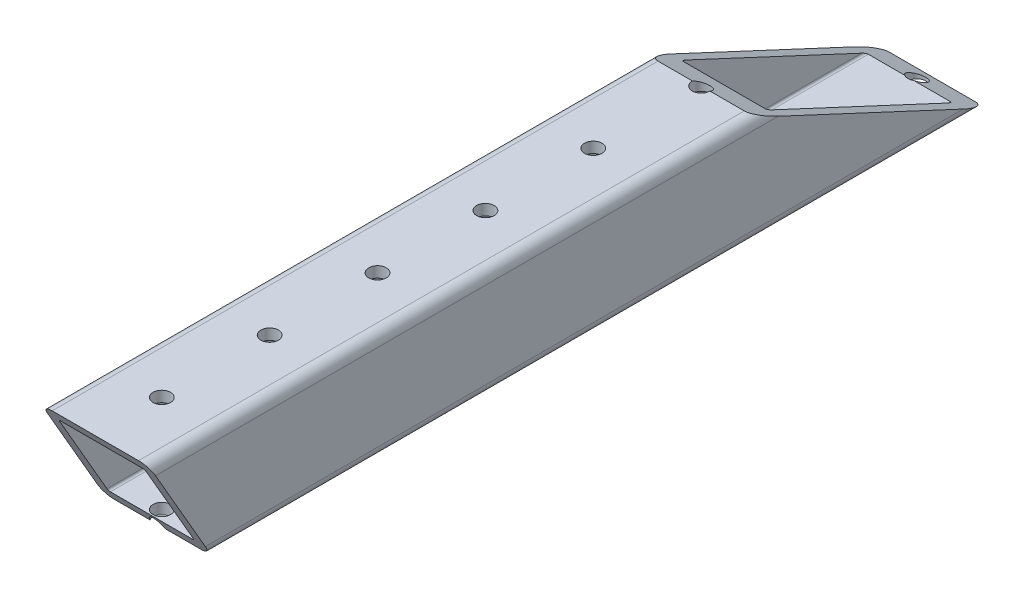
ISO-10303-21;
HEADER;
FILE_DESCRIPTION(('STEP AP214'),'2;1');
FILE_NAME('part.step','',(''),(''),'','','');
FILE_SCHEMA(('AUTOMOTIVE_DESIGN { 1 0 10303 214 1 1 1 1 }'));
ENDSEC;
DATA;
#1=APPLICATION_CONTEXT('core data for automotive mechanical design processes');
#2=APPLICATION_PROTOCOL_DEFINITION('international standard','automotive_design',2000,#1);
#3=PRODUCT_CONTEXT('',#1,'mechanical');
#4=PRODUCT('Part','Part','',(#3));
#5=PRODUCT_RELATED_PRODUCT_CATEGORY('part','',(#4));
#6=PRODUCT_DEFINITION_FORMATION('','',#4);
#7=PRODUCT_DEFINITION_CONTEXT('part definition',#1,'design');
#8=PRODUCT_DEFINITION('design','',#6,#7);
#9=PRODUCT_DEFINITION_SHAPE('','',#8);
#10=(LENGTH_UNIT() NAMED_UNIT(*) SI_UNIT(.MILLI.,.METRE.));
#11=(NAMED_UNIT(*) PLANE_ANGLE_UNIT() SI_UNIT($,.RADIAN.));
#12=(NAMED_UNIT(*) SI_UNIT($,.STERADIAN.) SOLID_ANGLE_UNIT());
#13=UNCERTAINTY_MEASURE_WITH_UNIT(LENGTH_MEASURE(1.E-05),#10,'distance_accuracy_value','');
#14=(GEOMETRIC_REPRESENTATION_CONTEXT(3) GLOBAL_UNCERTAINTY_ASSIGNED_CONTEXT((#13)) GLOBAL_UNIT_ASSIGNED_CONTEXT((#10,
#11,#12)) REPRESENTATION_CONTEXT('',''));
#15=CARTESIAN_POINT('',(0.,0.,0.));
#16=DIRECTION('',(0.,0.,1.));
#17=DIRECTION('',(1.,0.,0.));
#18=AXIS2_PLACEMENT_3D('',#15,#16,#17);
#19=CARTESIAN_POINT('',(-9.65999999999999,9.66,749.3));
#20=DIRECTION('',(0.,0.,1.));
#21=DIRECTION('',(1.,0.,0.));
#22=AXIS2_PLACEMENT_3D('',#19,#20,#21);
#23=CYLINDRICAL_SURFACE('',#22,0.5);
#24=DIRECTION('',(0.,0.,-1.));
#25=VECTOR('',#24,1.);
#26=CARTESIAN_POINT('',(-9.65999999999999,10.16,749.3));
#27=LINE('',#26,#25);
#28=CARTESIAN_POINT('',(-9.65999999999999,10.16,166.57124347975));
#29=VERTEX_POINT('',#28);
#30=CARTESIAN_POINT('',(-9.65999999999999,10.16,19.9529524219182));
#31=VERTEX_POINT('',#30);
#32=EDGE_CURVE('E271',#29,#31,#27,.T.);
#33=ORIENTED_EDGE('',*,*,#32,.F.);
#34=CARTESIAN_POINT('',(-9.65999999999999,9.66,166.282568345155));
#35=DIRECTION('',(0.,0.500000000000004,-0.866025403784436));
#36=DIRECTION('',(0.,0.866025403784436,0.500000000000004));
#37=AXIS2_PLACEMENT_3D('',#34,#35,#36);
#38=ELLIPSE('',#37,0.577350269189628,0.5);
#39=CARTESIAN_POINT('',(-10.16,9.66,166.282568345155));
#40=VERTEX_POINT('',#39);
#41=EDGE_CURVE('E58',#29,#40,#38,.F.);
#42=ORIENTED_EDGE('',*,*,#41,.T.);
#43=DIRECTION('',(0.,0.,-1.));
#44=VECTOR('',#43,1.);
#45=CARTESIAN_POINT('',(-10.16,9.66,749.3));
#46=LINE('',#45,#44);
#47=CARTESIAN_POINT('',(-10.16,9.66,18.8806989616635));
#48=VERTEX_POINT('',#47);
#49=EDGE_CURVE('E210',#48,#40,#46,.F.);
#50=ORIENTED_EDGE('',*,*,#49,.F.);
#51=CARTESIAN_POINT('',(-9.65999999999999,9.66,18.8806989616634));
#52=DIRECTION('',(0.,-0.906307787036643,0.422618261740715));
#53=DIRECTION('',(0.,0.422618261740715,0.906307787036643));
#54=AXIS2_PLACEMENT_3D('',#51,#52,#53);
#55=ELLIPSE('',#54,1.18310079157621,0.5);
#56=EDGE_CURVE('E196',#48,#31,#55,.F.);
#57=ORIENTED_EDGE('',*,*,#56,.T.);
#58=EDGE_LOOP('',(#33,#42,#50,#57));
#59=FACE_BOUND('',#58,.T.);
#60=ADVANCED_FACE('F36',(#59),#23,.F.);
#61=CARTESIAN_POINT('',(0.,-12.7,25.4000000000001));
#62=DIRECTION('',(0.,1.,0.));
#63=DIRECTION('',(0.,0.,1.));
#64=AXIS2_PLACEMENT_3D('',#61,#62,#63);
#65=CYLINDRICAL_SURFACE('',#64,2.07009999999997);
#66=CARTESIAN_POINT('',(0.,10.16,25.4000000000001));
#67=DIRECTION('',(0.,1.,0.));
#68=DIRECTION('',(0.,0.,1.));
#69=AXIS2_PLACEMENT_3D('',#66,#67,#68);
#70=CIRCLE('',#69,2.07009999999997);
#71=CARTESIAN_POINT('',(0.,10.16,27.4701000000001));
#72=VERTEX_POINT('',#71);
#73=EDGE_CURVE('E268',#72,#72,#70,.T.);
#74=ORIENTED_EDGE('',*,*,#73,.F.);
#75=EDGE_LOOP('',(#74));
#76=FACE_BOUND('',#75,.T.);
#77=CARTESIAN_POINT('',(0.,12.7,25.4000000000001));
#78=DIRECTION('',(0.,1.,0.));
#79=DIRECTION('',(0.,0.,1.));
#80=AXIS2_PLACEMENT_3D('',#77,#78,#79);
#81=CIRCLE('',#80,2.07009999999997);
#82=CARTESIAN_POINT('',(-2.07009999999997,12.7,25.4000000000122));
#83=VERTEX_POINT('',#82);
#84=CARTESIAN_POINT('',(2.07009999999997,12.7,25.4000000000122));
#85=VERTEX_POINT('',#84);
#86=EDGE_CURVE('E317',#83,#85,#81,.T.);
#87=ORIENTED_EDGE('',*,*,#86,.T.);
#88=CARTESIAN_POINT('',(0.,12.6999999999944,25.4000000000001));
#89=DIRECTION('',(0.,-0.906307787036643,0.422618261740715));
#90=DIRECTION('',(0.,0.422618261740715,0.906307787036643));
#91=AXIS2_PLACEMENT_3D('',#88,#89,#90);
#92=ELLIPSE('',#91,2.28410263004424,2.07009999999997);
#93=EDGE_CURVE('E350',#85,#83,#92,.F.);
#94=ORIENTED_EDGE('',*,*,#93,.T.);
#95=EDGE_LOOP('',(#87,#94));
#96=FACE_BOUND('',#95,.T.);
#97=ADVANCED_FACE('F433',(#76,#96),#65,.F.);
#98=CARTESIAN_POINT('',(0.,-12.7,50.8000000000001));
#99=DIRECTION('',(0.,1.,0.));
#100=DIRECTION('',(0.,0.,1.));
#101=AXIS2_PLACEMENT_3D('',#98,#99,#100);
#102=CYLINDRICAL_SURFACE('',#101,2.07009999999998);
#103=CARTESIAN_POINT('',(0.,10.16,50.8000000000001));
#104=DIRECTION('',(0.,1.,0.));
#105=DIRECTION('',(0.,0.,1.));
#106=AXIS2_PLACEMENT_3D('',#103,#104,#105);
#107=CIRCLE('',#106,2.07009999999998);
#108=CARTESIAN_POINT('',(0.,10.16,52.8701));
#109=VERTEX_POINT('',#108);
#110=EDGE_CURVE('E265',#109,#109,#107,.T.);
#111=ORIENTED_EDGE('',*,*,#110,.F.);
#112=EDGE_LOOP('',(#111));
#113=FACE_BOUND('',#112,.T.);
#114=CARTESIAN_POINT('',(0.,12.7,50.8000000000001));
#115=DIRECTION('',(0.,1.,0.));
#116=DIRECTION('',(0.,0.,1.));
#117=AXIS2_PLACEMENT_3D('',#114,#115,#116);
#118=CIRCLE('',#117,2.07009999999998);
#119=CARTESIAN_POINT('',(0.,12.7,52.8701));
#120=VERTEX_POINT('',#119);
#121=EDGE_CURVE('E314',#120,#120,#118,.T.);
#122=ORIENTED_EDGE('',*,*,#121,.T.);
#123=EDGE_LOOP('',(#122));
#124=FACE_BOUND('',#123,.T.);
#125=ADVANCED_FACE('F435',(#113,#124),#102,.F.);
#126=CARTESIAN_POINT('',(0.,-12.7,76.2));
#127=DIRECTION('',(0.,1.,0.));
#128=DIRECTION('',(0.,0.,1.));
#129=AXIS2_PLACEMENT_3D('',#126,#127,#128);
#130=CYLINDRICAL_SURFACE('',#129,2.07009999999998);
#131=CARTESIAN_POINT('',(0.,10.16,76.2));
#132=DIRECTION('',(0.,1.,0.));
#133=DIRECTION('',(0.,0.,1.));
#134=AXIS2_PLACEMENT_3D('',#131,#132,#133);
#135=CIRCLE('',#134,2.07009999999998);
#136=CARTESIAN_POINT('',(0.,10.16,78.2701));
#137=VERTEX_POINT('',#136);
#138=EDGE_CURVE('E262',#137,#137,#135,.T.);
#139=ORIENTED_EDGE('',*,*,#138,.F.);
#140=EDGE_LOOP('',(#139));
#141=FACE_BOUND('',#140,.T.);
#142=CARTESIAN_POINT('',(0.,12.7,76.2));
#143=DIRECTION('',(0.,1.,0.));
#144=DIRECTION('',(0.,0.,1.));
#145=AXIS2_PLACEMENT_3D('',#142,#143,#144);
#146=CIRCLE('',#145,2.07009999999998);
#147=CARTESIAN_POINT('',(0.,12.7,78.2701));
#148=VERTEX_POINT('',#147);
#149=EDGE_CURVE('E311',#148,#148,#146,.T.);
#150=ORIENTED_EDGE('',*,*,#149,.T.);
#151=EDGE_LOOP('',(#150));
#152=FACE_BOUND('',#151,.T.);
#153=ADVANCED_FACE('F441',(#141,#152),#130,.F.);
#154=CARTESIAN_POINT('',(0.,-12.7,101.6));
#155=DIRECTION('',(0.,1.,0.));
#156=DIRECTION('',(0.,0.,1.));
#157=AXIS2_PLACEMENT_3D('',#154,#155,#156);
#158=CYLINDRICAL_SURFACE('',#157,2.07009999999998);
#159=CARTESIAN_POINT('',(0.,10.16,101.6));
#160=DIRECTION('',(0.,1.,0.));
#161=DIRECTION('',(0.,0.,1.));
#162=AXIS2_PLACEMENT_3D('',#159,#160,#161);
#163=CIRCLE('',#162,2.07009999999998);
#164=CARTESIAN_POINT('',(0.,10.16,103.6701));
#165=VERTEX_POINT('',#164);
#166=EDGE_CURVE('E259',#165,#165,#163,.T.);
#167=ORIENTED_EDGE('',*,*,#166,.F.);
#168=EDGE_LOOP('',(#167));
#169=FACE_BOUND('',#168,.T.);
#170=CARTESIAN_POINT('',(0.,12.7,101.6));
#171=DIRECTION('',(0.,1.,0.));
#172=DIRECTION('',(0.,0.,1.));
#173=AXIS2_PLACEMENT_3D('',#170,#171,#172);
#174=CIRCLE('',#173,2.07009999999998);
#175=CARTESIAN_POINT('',(0.,12.7,103.6701));
#176=VERTEX_POINT('',#175);
#177=EDGE_CURVE('E308',#176,#176,#174,.T.);
#178=ORIENTED_EDGE('',*,*,#177,.T.);
#179=EDGE_LOOP('',(#178));
#180=FACE_BOUND('',#179,.T.);
#181=ADVANCED_FACE('F536',(#169,#180),#158,.F.);
#182=CARTESIAN_POINT('',(0.,-12.7,127.));
#183=DIRECTION('',(0.,1.,0.));
#184=DIRECTION('',(0.,0.,1.));
#185=AXIS2_PLACEMENT_3D('',#182,#183,#184);
#186=CYLINDRICAL_SURFACE('',#185,2.07009999999996);
#187=CARTESIAN_POINT('',(0.,10.16,127.));
#188=DIRECTION('',(0.,1.,0.));
#189=DIRECTION('',(0.,0.,1.));
#190=AXIS2_PLACEMENT_3D('',#187,#188,#189);
#191=CIRCLE('',#190,2.07009999999996);
#192=CARTESIAN_POINT('',(0.,10.16,129.0701));
#193=VERTEX_POINT('',#192);
#194=EDGE_CURVE('E256',#193,#193,#191,.T.);
#195=ORIENTED_EDGE('',*,*,#194,.F.);
#196=EDGE_LOOP('',(#195));
#197=FACE_BOUND('',#196,.T.);
#198=CARTESIAN_POINT('',(0.,12.7,127.));
#199=DIRECTION('',(0.,1.,0.));
#200=DIRECTION('',(0.,0.,1.));
#201=AXIS2_PLACEMENT_3D('',#198,#199,#200);
#202=CIRCLE('',#201,2.07009999999996);
#203=CARTESIAN_POINT('',(0.,12.7,129.0701));
#204=VERTEX_POINT('',#203);
#205=EDGE_CURVE('E305',#204,#204,#202,.T.);
#206=ORIENTED_EDGE('',*,*,#205,.T.);
#207=EDGE_LOOP('',(#206));
#208=FACE_BOUND('',#207,.T.);
#209=ADVANCED_FACE('F532',(#197,#208),#186,.F.);
#210=CARTESIAN_POINT('',(0.,-12.7,152.4));
#211=DIRECTION('',(0.,1.,0.));
#212=DIRECTION('',(0.,0.,1.));
#213=AXIS2_PLACEMENT_3D('',#210,#211,#212);
#214=CYLINDRICAL_SURFACE('',#213,2.07009999999996);
#215=CARTESIAN_POINT('',(0.,10.16,152.4));
#216=DIRECTION('',(0.,1.,0.));
#217=DIRECTION('',(0.,0.,1.));
#218=AXIS2_PLACEMENT_3D('',#215,#216,#217);
#219=CIRCLE('',#218,2.07009999999996);
#220=CARTESIAN_POINT('',(0.,10.16,154.4701));
#221=VERTEX_POINT('',#220);
#222=EDGE_CURVE('E202',#221,#221,#219,.T.);
#223=ORIENTED_EDGE('',*,*,#222,.F.);
#224=EDGE_LOOP('',(#223));
#225=FACE_BOUND('',#224,.T.);
#226=CARTESIAN_POINT('',(0.,12.7,152.4));
#227=DIRECTION('',(0.,1.,0.));
#228=DIRECTION('',(0.,0.,1.));
#229=AXIS2_PLACEMENT_3D('',#226,#227,#228);
#230=CIRCLE('',#229,2.07009999999996);
#231=CARTESIAN_POINT('',(0.,12.7,154.4701));
#232=VERTEX_POINT('',#231);
#233=EDGE_CURVE('E302',#232,#232,#230,.T.);
#234=ORIENTED_EDGE('',*,*,#233,.T.);
#235=EDGE_LOOP('',(#234));
#236=FACE_BOUND('',#235,.T.);
#237=ADVANCED_FACE('F528',(#225,#236),#214,.F.);
#238=CARTESIAN_POINT('',(9.66,9.65999999999999,749.3));
#239=DIRECTION('',(0.,0.,1.));
#240=DIRECTION('',(1.,0.,0.));
#241=AXIS2_PLACEMENT_3D('',#238,#239,#240);
#242=CYLINDRICAL_SURFACE('',#241,0.5);
#243=DIRECTION('',(0.,0.,1.));
#244=VECTOR('',#243,1.);
#245=CARTESIAN_POINT('',(10.16,9.65999999999999,749.3));
#246=LINE('',#245,#244);
#247=CARTESIAN_POINT('',(10.16,9.66,166.282568345155));
#248=VERTEX_POINT('',#247);
#249=CARTESIAN_POINT('',(10.16,9.66,18.8806989616635));
#250=VERTEX_POINT('',#249);
#251=EDGE_CURVE('E199',#248,#250,#246,.F.);
#252=ORIENTED_EDGE('',*,*,#251,.F.);
#253=CARTESIAN_POINT('',(9.66,9.65999999999999,166.282568345155));
#254=DIRECTION('',(0.,0.500000000000004,-0.866025403784436));
#255=DIRECTION('',(0.,0.866025403784436,0.500000000000004));
#256=AXIS2_PLACEMENT_3D('',#253,#254,#255);
#257=ELLIPSE('',#256,0.577350269189628,0.5);
#258=CARTESIAN_POINT('',(9.66,10.16,166.57124347975));
#259=VERTEX_POINT('',#258);
#260=EDGE_CURVE('E378',#248,#259,#257,.F.);
#261=ORIENTED_EDGE('',*,*,#260,.T.);
#262=DIRECTION('',(0.,0.,-1.));
#263=VECTOR('',#262,1.);
#264=CARTESIAN_POINT('',(9.66,10.16,749.3));
#265=LINE('',#264,#263);
#266=CARTESIAN_POINT('',(9.66,10.16,19.9529524219182));
#267=VERTEX_POINT('',#266);
#268=EDGE_CURVE('E209',#267,#259,#265,.F.);
#269=ORIENTED_EDGE('',*,*,#268,.F.);
#270=CARTESIAN_POINT('',(9.66,9.65999999999999,18.8806989616634));
#271=DIRECTION('',(0.,-0.906307787036643,0.422618261740715));
#272=DIRECTION('',(0.,0.422618261740715,0.906307787036643));
#273=AXIS2_PLACEMENT_3D('',#270,#271,#272);
#274=ELLIPSE('',#273,1.18310079157621,0.5);
#275=EDGE_CURVE('E330',#267,#250,#274,.F.);
#276=ORIENTED_EDGE('',*,*,#275,.T.);
#277=EDGE_LOOP('',(#252,#261,#269,#276));
#278=FACE_BOUND('',#277,.T.);
#279=ADVANCED_FACE('F524',(#278),#242,.F.);
#280=CARTESIAN_POINT('',(-9.65999999999999,-9.66,749.3));
#281=DIRECTION('',(0.,0.,1.));
#282=DIRECTION('',(1.,0.,0.));
#283=AXIS2_PLACEMENT_3D('',#280,#281,#282);
#284=CYLINDRICAL_SURFACE('',#283,0.5);
#285=DIRECTION('',(0.,0.,-1.));
#286=VECTOR('',#285,1.);
#287=CARTESIAN_POINT('',(-10.16,-9.66,749.3));
#288=LINE('',#287,#286);
#289=CARTESIAN_POINT('',(-10.16,-9.66,155.128161144411));
#290=VERTEX_POINT('',#289);
#291=CARTESIAN_POINT('',(-10.16,-9.66,-22.5511747425793));
#292=VERTEX_POINT('',#291);
#293=EDGE_CURVE('E207',#290,#292,#288,.T.);
#294=ORIENTED_EDGE('',*,*,#293,.F.);
#295=CARTESIAN_POINT('',(-9.65999999999999,-9.66,155.128161144411));
#296=DIRECTION('',(0.,0.500000000000004,-0.866025403784436));
#297=DIRECTION('',(0.,0.866025403784436,0.500000000000004));
#298=AXIS2_PLACEMENT_3D('',#295,#296,#297);
#299=ELLIPSE('',#298,0.577350269189628,0.5);
#300=CARTESIAN_POINT('',(-9.65999999999999,-10.16,154.839486009817));
#301=VERTEX_POINT('',#300);
#302=EDGE_CURVE('E384',#290,#301,#299,.F.);
#303=ORIENTED_EDGE('',*,*,#302,.T.);
#304=DIRECTION('',(0.,0.,1.));
#305=VECTOR('',#304,1.);
#306=CARTESIAN_POINT('',(-9.65999999999999,-10.16,749.3));
#307=LINE('',#306,#305);
#308=CARTESIAN_POINT('',(-9.65999999999999,-10.16,-23.623428202834));
#309=VERTEX_POINT('',#308);
#310=EDGE_CURVE('E206',#309,#301,#307,.T.);
#311=ORIENTED_EDGE('',*,*,#310,.F.);
#312=CARTESIAN_POINT('',(-9.65999999999999,-9.66,-22.5511747425794));
#313=DIRECTION('',(0.,-0.906307787036643,0.422618261740715));
#314=DIRECTION('',(0.,0.422618261740715,0.906307787036643));
#315=AXIS2_PLACEMENT_3D('',#312,#313,#314);
#316=ELLIPSE('',#315,1.18310079157621,0.5);
#317=EDGE_CURVE('E335',#309,#292,#316,.F.);
#318=ORIENTED_EDGE('',*,*,#317,.T.);
#319=EDGE_LOOP('',(#294,#303,#311,#318));
#320=FACE_BOUND('',#319,.T.);
#321=ADVANCED_FACE('F520',(#320),#284,.F.);
#322=CARTESIAN_POINT('',(9.66,-9.66,749.3));
#323=DIRECTION('',(0.,0.,1.));
#324=DIRECTION('',(1.,0.,0.));
#325=AXIS2_PLACEMENT_3D('',#322,#323,#324);
#326=CYLINDRICAL_SURFACE('',#325,0.5);
#327=DIRECTION('',(0.,0.,1.));
#328=VECTOR('',#327,1.);
#329=CARTESIAN_POINT('',(9.66,-10.16,749.3));
#330=LINE('',#329,#328);
#331=CARTESIAN_POINT('',(9.66,-10.16,154.839486009817));
#332=VERTEX_POINT('',#331);
#333=CARTESIAN_POINT('',(9.66,-10.16,-23.623428202834));
#334=VERTEX_POINT('',#333);
#335=EDGE_CURVE('E250',#332,#334,#330,.F.);
#336=ORIENTED_EDGE('',*,*,#335,.F.);
#337=CARTESIAN_POINT('',(9.66,-9.66,155.128161144411));
#338=DIRECTION('',(0.,0.500000000000004,-0.866025403784436));
#339=DIRECTION('',(0.,0.866025403784436,0.500000000000004));
#340=AXIS2_PLACEMENT_3D('',#337,#338,#339);
#341=ELLIPSE('',#340,0.577350269189628,0.5);
#342=CARTESIAN_POINT('',(10.16,-9.66,155.128161144411));
#343=VERTEX_POINT('',#342);
#344=EDGE_CURVE('E387',#332,#343,#341,.F.);
#345=ORIENTED_EDGE('',*,*,#344,.T.);
#346=DIRECTION('',(0.,0.,1.));
#347=VECTOR('',#346,1.);
#348=CARTESIAN_POINT('',(10.16,-9.66,749.3));
#349=LINE('',#348,#347);
#350=CARTESIAN_POINT('',(10.16,-9.66,-22.5511747425793));
#351=VERTEX_POINT('',#350);
#352=EDGE_CURVE('E201',#351,#343,#349,.T.);
#353=ORIENTED_EDGE('',*,*,#352,.F.);
#354=CARTESIAN_POINT('',(9.66,-9.66,-22.5511747425794));
#355=DIRECTION('',(0.,-0.906307787036643,0.422618261740715));
#356=DIRECTION('',(0.,0.422618261740715,0.906307787036643));
#357=AXIS2_PLACEMENT_3D('',#354,#355,#356);
#358=ELLIPSE('',#357,1.18310079157621,0.5);
#359=EDGE_CURVE('E342',#351,#334,#358,.F.);
#360=ORIENTED_EDGE('',*,*,#359,.T.);
#361=EDGE_LOOP('',(#336,#345,#353,#360));
#362=FACE_BOUND('',#361,.T.);
#363=ADVANCED_FACE('F516',(#362),#326,.F.);
#364=CARTESIAN_POINT('',(0.,-12.7,-25.4));
#365=DIRECTION('',(0.,1.,0.));
#366=DIRECTION('',(0.,0.,1.));
#367=AXIS2_PLACEMENT_3D('',#364,#365,#366);
#368=CYLINDRICAL_SURFACE('',#367,2.07009999999997);
#369=CARTESIAN_POINT('',(0.,-10.16,-25.4));
#370=DIRECTION('',(0.,1.,0.));
#371=DIRECTION('',(0.,0.,1.));
#372=AXIS2_PLACEMENT_3D('',#369,#370,#371);
#373=CIRCLE('',#372,2.07009999999997);
#374=CARTESIAN_POINT('',(1.06259430617449,-10.16,-23.623428202834));
#375=VERTEX_POINT('',#374);
#376=CARTESIAN_POINT('',(-1.06259430617449,-10.16,-23.623428202834));
#377=VERTEX_POINT('',#376);
#378=EDGE_CURVE('E247',#375,#377,#373,.F.);
#379=ORIENTED_EDGE('',*,*,#378,.F.);
#380=CARTESIAN_POINT('',(0.,-10.9884290342807,-25.4));
#381=DIRECTION('',(0.,-0.906307787036643,0.422618261740715));
#382=DIRECTION('',(0.,0.422618261740715,0.906307787036643));
#383=AXIS2_PLACEMENT_3D('',#380,#381,#382);
#384=ELLIPSE('',#383,2.28410263004424,2.07009999999997);
#385=EDGE_CURVE('E345',#375,#377,#384,.F.);
#386=ORIENTED_EDGE('',*,*,#385,.T.);
#387=EDGE_LOOP('',(#379,#386));
#388=FACE_BOUND('',#387,.T.);
#389=CARTESIAN_POINT('',(0.,-12.7,-25.4));
#390=DIRECTION('',(0.,1.,0.));
#391=DIRECTION('',(0.,0.,1.));
#392=AXIS2_PLACEMENT_3D('',#389,#390,#391);
#393=CIRCLE('',#392,2.07009999999997);
#394=CARTESIAN_POINT('',(0.,-12.7,-23.3299));
#395=VERTEX_POINT('',#394);
#396=EDGE_CURVE('E295',#395,#395,#393,.F.);
#397=ORIENTED_EDGE('',*,*,#396,.T.);
#398=EDGE_LOOP('',(#397));
#399=FACE_BOUND('',#398,.T.);
#400=ADVANCED_FACE('F512',(#388,#399),#368,.F.);
#401=CARTESIAN_POINT('',(0.,-12.7,0.));
#402=DIRECTION('',(0.,1.,0.));
#403=DIRECTION('',(0.,0.,1.));
#404=AXIS2_PLACEMENT_3D('',#401,#402,#403);
#405=CYLINDRICAL_SURFACE('',#404,2.07009999999997);
#406=CARTESIAN_POINT('',(0.,-10.16,0.));
#407=DIRECTION('',(0.,1.,0.));
#408=DIRECTION('',(0.,0.,1.));
#409=AXIS2_PLACEMENT_3D('',#406,#407,#408);
#410=CIRCLE('',#409,2.07009999999997);
#411=CARTESIAN_POINT('',(0.,-10.16,2.07009999999997));
#412=VERTEX_POINT('',#411);
#413=EDGE_CURVE('E244',#412,#412,#410,.F.);
#414=ORIENTED_EDGE('',*,*,#413,.F.);
#415=EDGE_LOOP('',(#414));
#416=FACE_BOUND('',#415,.T.);
#417=CARTESIAN_POINT('',(0.,-12.7,0.));
#418=DIRECTION('',(0.,1.,0.));
#419=DIRECTION('',(0.,0.,1.));
#420=AXIS2_PLACEMENT_3D('',#417,#418,#419);
#421=CIRCLE('',#420,2.07009999999997);
#422=CARTESIAN_POINT('',(0.,-12.7,2.07009999999997));
#423=VERTEX_POINT('',#422);
#424=EDGE_CURVE('E292',#423,#423,#421,.F.);
#425=ORIENTED_EDGE('',*,*,#424,.T.);
#426=EDGE_LOOP('',(#425));
#427=FACE_BOUND('',#426,.T.);
#428=ADVANCED_FACE('F508',(#416,#427),#405,.F.);
#429=CARTESIAN_POINT('',(0.,-12.7,25.4000000000001));
#430=DIRECTION('',(0.,1.,0.));
#431=DIRECTION('',(0.,0.,1.));
#432=AXIS2_PLACEMENT_3D('',#429,#430,#431);
#433=CYLINDRICAL_SURFACE('',#432,2.07009999999997);
#434=CARTESIAN_POINT('',(0.,-10.16,25.4000000000001));
#435=DIRECTION('',(0.,1.,0.));
#436=DIRECTION('',(0.,0.,1.));
#437=AXIS2_PLACEMENT_3D('',#434,#435,#436);
#438=CIRCLE('',#437,2.07009999999997);
#439=CARTESIAN_POINT('',(0.,-10.16,27.4701000000001));
#440=VERTEX_POINT('',#439);
#441=EDGE_CURVE('E241',#440,#440,#438,.F.);
#442=ORIENTED_EDGE('',*,*,#441,.F.);
#443=EDGE_LOOP('',(#442));
#444=FACE_BOUND('',#443,.T.);
#445=CARTESIAN_POINT('',(0.,-12.7,25.4000000000001));
#446=DIRECTION('',(0.,1.,0.));
#447=DIRECTION('',(0.,0.,1.));
#448=AXIS2_PLACEMENT_3D('',#445,#446,#447);
#449=CIRCLE('',#448,2.07009999999997);
#450=CARTESIAN_POINT('',(0.,-12.7,27.4701000000001));
#451=VERTEX_POINT('',#450);
#452=EDGE_CURVE('E289',#451,#451,#449,.F.);
#453=ORIENTED_EDGE('',*,*,#452,.T.);
#454=EDGE_LOOP('',(#453));
#455=FACE_BOUND('',#454,.T.);
#456=ADVANCED_FACE('F504',(#444,#455),#433,.F.);
#457=CARTESIAN_POINT('',(0.,-12.7,50.8000000000001));
#458=DIRECTION('',(0.,1.,0.));
#459=DIRECTION('',(0.,0.,1.));
#460=AXIS2_PLACEMENT_3D('',#457,#458,#459);
#461=CYLINDRICAL_SURFACE('',#460,2.07009999999998);
#462=CARTESIAN_POINT('',(0.,-10.16,50.8000000000001));
#463=DIRECTION('',(0.,1.,0.));
#464=DIRECTION('',(0.,0.,1.));
#465=AXIS2_PLACEMENT_3D('',#462,#463,#464);
#466=CIRCLE('',#465,2.07009999999998);
#467=CARTESIAN_POINT('',(0.,-10.16,52.8701));
#468=VERTEX_POINT('',#467);
#469=EDGE_CURVE('E238',#468,#468,#466,.F.);
#470=ORIENTED_EDGE('',*,*,#469,.F.);
#471=EDGE_LOOP('',(#470));
#472=FACE_BOUND('',#471,.T.);
#473=CARTESIAN_POINT('',(0.,-12.7,50.8000000000001));
#474=DIRECTION('',(0.,1.,0.));
#475=DIRECTION('',(0.,0.,1.));
#476=AXIS2_PLACEMENT_3D('',#473,#474,#475);
#477=CIRCLE('',#476,2.07009999999998);
#478=CARTESIAN_POINT('',(0.,-12.7,52.8701));
#479=VERTEX_POINT('',#478);
#480=EDGE_CURVE('E286',#479,#479,#477,.F.);
#481=ORIENTED_EDGE('',*,*,#480,.T.);
#482=EDGE_LOOP('',(#481));
#483=FACE_BOUND('',#482,.T.);
#484=ADVANCED_FACE('F500',(#472,#483),#461,.F.);
#485=CARTESIAN_POINT('',(0.,-12.7,76.2));
#486=DIRECTION('',(0.,1.,0.));
#487=DIRECTION('',(0.,0.,1.));
#488=AXIS2_PLACEMENT_3D('',#485,#486,#487);
#489=CYLINDRICAL_SURFACE('',#488,2.07009999999998);
#490=CARTESIAN_POINT('',(0.,-10.16,76.2));
#491=DIRECTION('',(0.,1.,0.));
#492=DIRECTION('',(0.,0.,1.));
#493=AXIS2_PLACEMENT_3D('',#490,#491,#492);
#494=CIRCLE('',#493,2.07009999999998);
#495=CARTESIAN_POINT('',(0.,-10.16,78.2701));
#496=VERTEX_POINT('',#495);
#497=EDGE_CURVE('E235',#496,#496,#494,.F.);
#498=ORIENTED_EDGE('',*,*,#497,.F.);
#499=EDGE_LOOP('',(#498));
#500=FACE_BOUND('',#499,.T.);
#501=CARTESIAN_POINT('',(0.,-12.7,76.2));
#502=DIRECTION('',(0.,1.,0.));
#503=DIRECTION('',(0.,0.,1.));
#504=AXIS2_PLACEMENT_3D('',#501,#502,#503);
#505=CIRCLE('',#504,2.07009999999998);
#506=CARTESIAN_POINT('',(0.,-12.7,78.2701));
#507=VERTEX_POINT('',#506);
#508=EDGE_CURVE('E283',#507,#507,#505,.F.);
#509=ORIENTED_EDGE('',*,*,#508,.T.);
#510=EDGE_LOOP('',(#509));
#511=FACE_BOUND('',#510,.T.);
#512=ADVANCED_FACE('F496',(#500,#511),#489,.F.);
#513=CARTESIAN_POINT('',(0.,-12.7,101.6));
#514=DIRECTION('',(0.,1.,0.));
#515=DIRECTION('',(0.,0.,1.));
#516=AXIS2_PLACEMENT_3D('',#513,#514,#515);
#517=CYLINDRICAL_SURFACE('',#516,2.07009999999998);
#518=CARTESIAN_POINT('',(0.,-10.16,101.6));
#519=DIRECTION('',(0.,1.,0.));
#520=DIRECTION('',(0.,0.,1.));
#521=AXIS2_PLACEMENT_3D('',#518,#519,#520);
#522=CIRCLE('',#521,2.07009999999998);
#523=CARTESIAN_POINT('',(0.,-10.16,103.6701));
#524=VERTEX_POINT('',#523);
#525=EDGE_CURVE('E232',#524,#524,#522,.F.);
#526=ORIENTED_EDGE('',*,*,#525,.F.);
#527=EDGE_LOOP('',(#526));
#528=FACE_BOUND('',#527,.T.);
#529=CARTESIAN_POINT('',(0.,-12.7,101.6));
#530=DIRECTION('',(0.,1.,0.));
#531=DIRECTION('',(0.,0.,1.));
#532=AXIS2_PLACEMENT_3D('',#529,#530,#531);
#533=CIRCLE('',#532,2.07009999999998);
#534=CARTESIAN_POINT('',(0.,-12.7,103.6701));
#535=VERTEX_POINT('',#534);
#536=EDGE_CURVE('E280',#535,#535,#533,.F.);
#537=ORIENTED_EDGE('',*,*,#536,.T.);
#538=EDGE_LOOP('',(#537));
#539=FACE_BOUND('',#538,.T.);
#540=ADVANCED_FACE('F492',(#528,#539),#517,.F.);
#541=CARTESIAN_POINT('',(0.,-12.7,127.));
#542=DIRECTION('',(0.,1.,0.));
#543=DIRECTION('',(0.,0.,1.));
#544=AXIS2_PLACEMENT_3D('',#541,#542,#543);
#545=CYLINDRICAL_SURFACE('',#544,2.07009999999996);
#546=CARTESIAN_POINT('',(0.,-10.16,127.));
#547=DIRECTION('',(0.,1.,0.));
#548=DIRECTION('',(0.,0.,1.));
#549=AXIS2_PLACEMENT_3D('',#546,#547,#548);
#550=CIRCLE('',#549,2.07009999999996);
#551=CARTESIAN_POINT('',(0.,-10.16,129.0701));
#552=VERTEX_POINT('',#551);
#553=EDGE_CURVE('E229',#552,#552,#550,.F.);
#554=ORIENTED_EDGE('',*,*,#553,.F.);
#555=EDGE_LOOP('',(#554));
#556=FACE_BOUND('',#555,.T.);
#557=CARTESIAN_POINT('',(0.,-12.7,127.));
#558=DIRECTION('',(0.,1.,0.));
#559=DIRECTION('',(0.,0.,1.));
#560=AXIS2_PLACEMENT_3D('',#557,#558,#559);
#561=CIRCLE('',#560,2.07009999999996);
#562=CARTESIAN_POINT('',(0.,-12.7,129.0701));
#563=VERTEX_POINT('',#562);
#564=EDGE_CURVE('E277',#563,#563,#561,.F.);
#565=ORIENTED_EDGE('',*,*,#564,.T.);
#566=EDGE_LOOP('',(#565));
#567=FACE_BOUND('',#566,.T.);
#568=ADVANCED_FACE('F488',(#556,#567),#545,.F.);
#569=CARTESIAN_POINT('',(0.,-12.7,152.4));
#570=DIRECTION('',(0.,1.,0.));
#571=DIRECTION('',(0.,0.,1.));
#572=AXIS2_PLACEMENT_3D('',#569,#570,#571);
#573=CYLINDRICAL_SURFACE('',#572,2.07009999999996);
#574=CARTESIAN_POINT('',(0.,-10.16,152.4));
#575=DIRECTION('',(0.,1.,0.));
#576=DIRECTION('',(0.,0.,1.));
#577=AXIS2_PLACEMENT_3D('',#574,#575,#576);
#578=CIRCLE('',#577,2.07009999999996);
#579=CARTESIAN_POINT('',(0.,-10.16,154.4701));
#580=VERTEX_POINT('',#579);
#581=EDGE_CURVE('E226',#580,#580,#578,.F.);
#582=ORIENTED_EDGE('',*,*,#581,.F.);
#583=EDGE_LOOP('',(#582));
#584=FACE_BOUND('',#583,.T.);
#585=CARTESIAN_POINT('',(0.,-12.7,152.4));
#586=DIRECTION('',(0.,1.,0.));
#587=DIRECTION('',(0.,0.,1.));
#588=AXIS2_PLACEMENT_3D('',#585,#586,#587);
#589=CIRCLE('',#588,2.07009999999996);
#590=CARTESIAN_POINT('',(-1.82717082923077,-12.7,153.373016326075));
#591=VERTEX_POINT('',#590);
#592=CARTESIAN_POINT('',(1.82717082923078,-12.7,153.373016326075));
#593=VERTEX_POINT('',#592);
#594=EDGE_CURVE('E212',#591,#593,#589,.F.);
#595=ORIENTED_EDGE('',*,*,#594,.T.);
#596=CARTESIAN_POINT('',(0.,-14.3853137133555,152.4));
#597=DIRECTION('',(0.,0.500000000000004,-0.866025403784436));
#598=DIRECTION('',(0.,0.866025403784436,0.500000000000004));
#599=AXIS2_PLACEMENT_3D('',#596,#597,#598);
#600=ELLIPSE('',#599,4.1401999999999,2.07009999999996);
#601=EDGE_CURVE('E400',#593,#591,#600,.F.);
#602=ORIENTED_EDGE('',*,*,#601,.T.);
#603=EDGE_LOOP('',(#595,#602));
#604=FACE_BOUND('',#603,.T.);
#605=ADVANCED_FACE('F484',(#584,#604),#573,.F.);
#606=CARTESIAN_POINT('',(-10.16,12.7,749.3));
#607=DIRECTION('',(0.,-1.,0.));
#608=DIRECTION('',(0.,0.,-1.));
#609=AXIS2_PLACEMENT_3D('',#606,#607,#608);
#610=PLANE('',#609);
#611=ORIENTED_EDGE('',*,*,#233,.F.);
#612=EDGE_LOOP('',(#611));
#613=FACE_BOUND('',#612,.T.);
#614=ORIENTED_EDGE('',*,*,#205,.F.);
#615=EDGE_LOOP('',(#614));
#616=FACE_BOUND('',#615,.T.);
#617=ORIENTED_EDGE('',*,*,#177,.F.);
#618=EDGE_LOOP('',(#617));
#619=FACE_BOUND('',#618,.T.);
#620=ORIENTED_EDGE('',*,*,#149,.F.);
#621=EDGE_LOOP('',(#620));
#622=FACE_BOUND('',#621,.T.);
#623=ORIENTED_EDGE('',*,*,#121,.F.);
#624=EDGE_LOOP('',(#623));
#625=FACE_BOUND('',#624,.T.);
#626=DIRECTION('',(0.,0.,-1.));
#627=VECTOR('',#626,1.);
#628=CARTESIAN_POINT('',(-10.16,12.7,749.3));
#629=LINE('',#628,#627);
#630=CARTESIAN_POINT('',(-10.16,12.7,168.037713163491));
#631=VERTEX_POINT('',#630);
#632=CARTESIAN_POINT('',(-10.16,12.7,25.4000000000122));
#633=VERTEX_POINT('',#632);
#634=EDGE_CURVE('E221',#631,#633,#629,.T.);
#635=ORIENTED_EDGE('',*,*,#634,.F.);
#636=DIRECTION('',(1.,0.,0.));
#637=VECTOR('',#636,1.);
#638=CARTESIAN_POINT('',(-10.16,12.7,168.037713163491));
#639=LINE('',#638,#637);
#640=CARTESIAN_POINT('',(10.16,12.7,168.037713163491));
#641=VERTEX_POINT('',#640);
#642=EDGE_CURVE('E403',#631,#641,#639,.T.);
#643=ORIENTED_EDGE('',*,*,#642,.T.);
#644=DIRECTION('',(0.,0.,-1.));
#645=VECTOR('',#644,1.);
#646=CARTESIAN_POINT('',(10.16,12.7,749.3));
#647=LINE('',#646,#645);
#648=CARTESIAN_POINT('',(10.16,12.7,25.4000000000122));
#649=VERTEX_POINT('',#648);
#650=EDGE_CURVE('E183',#649,#641,#647,.F.);
#651=ORIENTED_EDGE('',*,*,#650,.F.);
#652=DIRECTION('',(-1.,0.,0.));
#653=VECTOR('',#652,1.);
#654=CARTESIAN_POINT('',(-10.16,12.7,25.4000000000122));
#655=LINE('',#654,#653);
#656=EDGE_CURVE('E352',#649,#85,#655,.T.);
#657=ORIENTED_EDGE('',*,*,#656,.T.);
#658=ORIENTED_EDGE('',*,*,#86,.F.);
#659=EDGE_CURVE('E353',#83,#633,#655,.T.);
#660=ORIENTED_EDGE('',*,*,#659,.T.);
#661=EDGE_LOOP('',(#635,#643,#651,#657,#658,#660));
#662=FACE_BOUND('',#661,.T.);
#663=ADVANCED_FACE('F431',(#613,#616,#619,#622,#625,#662),#610,.F.);
#664=CARTESIAN_POINT('',(-10.16,10.16,749.3));
#665=DIRECTION('',(0.,0.,-1.));
#666=DIRECTION('',(-1.,0.,0.));
#667=AXIS2_PLACEMENT_3D('',#664,#665,#666);
#668=CYLINDRICAL_SURFACE('',#667,2.54);
#669=CARTESIAN_POINT('',(-10.16,10.16,166.57124347975));
#670=DIRECTION('',(0.,0.500000000000004,-0.866025403784436));
#671=DIRECTION('',(0.,-0.866025403784436,-0.500000000000004));
#672=AXIS2_PLACEMENT_3D('',#669,#670,#671);
#673=ELLIPSE('',#672,2.93293936748331,2.54);
#674=CARTESIAN_POINT('',(-12.7,10.16,166.57124347975));
#675=VERTEX_POINT('',#674);
#676=EDGE_CURVE('E392',#631,#675,#673,.F.);
#677=ORIENTED_EDGE('',*,*,#676,.F.);
#678=ORIENTED_EDGE('',*,*,#634,.T.);
#679=CARTESIAN_POINT('',(-10.16,10.16,19.9529524219182));
#680=DIRECTION('',(0.,-0.906307787036643,0.422618261740715));
#681=DIRECTION('',(0.,-0.422618261740715,-0.906307787036643));
#682=AXIS2_PLACEMENT_3D('',#679,#680,#681);
#683=ELLIPSE('',#682,6.01015202120712,2.54);
#684=CARTESIAN_POINT('',(-12.7,10.1599999999999,19.9529524219181));
#685=VERTEX_POINT('',#684);
#686=EDGE_CURVE('E356',#685,#633,#683,.F.);
#687=ORIENTED_EDGE('',*,*,#686,.F.);
#688=DIRECTION('',(0.,0.,-1.));
#689=VECTOR('',#688,1.);
#690=CARTESIAN_POINT('',(-12.7,10.16,749.3));
#691=LINE('',#690,#689);
#692=EDGE_CURVE('E217',#685,#675,#691,.F.);
#693=ORIENTED_EDGE('',*,*,#692,.T.);
#694=EDGE_LOOP('',(#677,#678,#687,#693));
#695=FACE_BOUND('',#694,.T.);
#696=ADVANCED_FACE('F428',(#695),#668,.T.);
#697=CARTESIAN_POINT('',(-12.7,-10.16,749.3));
#698=DIRECTION('',(1.,0.,0.));
#699=DIRECTION('',(0.,0.,-1.));
#700=AXIS2_PLACEMENT_3D('',#697,#698,#699);
#701=PLANE('',#700);
#702=DIRECTION('',(0.,0.,-1.));
#703=VECTOR('',#702,1.);
#704=CARTESIAN_POINT('',(-12.7,-10.16,749.3));
#705=LINE('',#704,#703);
#706=CARTESIAN_POINT('',(-12.7,-10.16,154.839486009817));
#707=VERTEX_POINT('',#706);
#708=CARTESIAN_POINT('',(-12.7,-10.16,-23.623428202834));
#709=VERTEX_POINT('',#708);
#710=EDGE_CURVE('E213',#707,#709,#705,.T.);
#711=ORIENTED_EDGE('',*,*,#710,.F.);
#712=DIRECTION('',(0.,0.866025403784436,0.500000000000004));
#713=VECTOR('',#712,1.);
#714=CARTESIAN_POINT('',(-12.7,247.248953331128,303.454614507365));
#715=LINE('',#714,#713);
#716=EDGE_CURVE('E394',#707,#675,#715,.T.);
#717=ORIENTED_EDGE('',*,*,#716,.T.);
#718=ORIENTED_EDGE('',*,*,#692,.F.);
#719=DIRECTION('',(0.,-0.422618261740715,-0.906307787036643));
#720=VECTOR('',#719,1.);
#721=CARTESIAN_POINT('',(-12.7,285.886848565634,611.251087341185));
#722=LINE('',#721,#720);
#723=EDGE_CURVE('E359',#685,#709,#722,.T.);
#724=ORIENTED_EDGE('',*,*,#723,.T.);
#725=EDGE_LOOP('',(#711,#717,#718,#724));
#726=FACE_BOUND('',#725,.T.);
#727=ADVANCED_FACE('F425',(#726),#701,.F.);
#728=CARTESIAN_POINT('',(-10.16,-10.16,749.3));
#729=DIRECTION('',(0.,0.,-1.));
#730=DIRECTION('',(-1.,0.,0.));
#731=AXIS2_PLACEMENT_3D('',#728,#729,#730);
#732=CYLINDRICAL_SURFACE('',#731,2.54);
#733=CARTESIAN_POINT('',(-10.16,-10.16,154.839486009817));
#734=DIRECTION('',(0.,0.500000000000004,-0.866025403784436));
#735=DIRECTION('',(0.,-0.866025403784436,-0.500000000000004));
#736=AXIS2_PLACEMENT_3D('',#733,#734,#735);
#737=ELLIPSE('',#736,2.93293936748331,2.54);
#738=CARTESIAN_POINT('',(-10.16,-12.7,153.373016326075));
#739=VERTEX_POINT('',#738);
#740=EDGE_CURVE('E397',#707,#739,#737,.F.);
#741=ORIENTED_EDGE('',*,*,#740,.F.);
#742=ORIENTED_EDGE('',*,*,#710,.T.);
#743=CARTESIAN_POINT('',(-10.16,-10.16,-23.623428202834));
#744=DIRECTION('',(0.,-0.906307787036643,0.422618261740715));
#745=DIRECTION('',(0.,-0.422618261740715,-0.906307787036643));
#746=AXIS2_PLACEMENT_3D('',#743,#744,#745);
#747=ELLIPSE('',#746,6.01015202120712,2.54);
#748=CARTESIAN_POINT('',(-10.16,-12.7,-29.070475780928));
#749=VERTEX_POINT('',#748);
#750=EDGE_CURVE('E363',#749,#709,#747,.F.);
#751=ORIENTED_EDGE('',*,*,#750,.F.);
#752=DIRECTION('',(0.,0.,-1.));
#753=VECTOR('',#752,1.);
#754=CARTESIAN_POINT('',(-10.16,-12.7,749.3));
#755=LINE('',#754,#753);
#756=EDGE_CURVE('E216',#749,#739,#755,.F.);
#757=ORIENTED_EDGE('',*,*,#756,.T.);
#758=EDGE_LOOP('',(#741,#742,#751,#757));
#759=FACE_BOUND('',#758,.T.);
#760=ADVANCED_FACE('F418',(#759),#732,.T.);
#761=CARTESIAN_POINT('',(-10.16,-12.7,749.3));
#762=DIRECTION('',(0.,1.,0.));
#763=DIRECTION('',(0.,0.,1.));
#764=AXIS2_PLACEMENT_3D('',#761,#762,#763);
#765=PLANE('',#764);
#766=DIRECTION('',(0.,0.,-1.));
#767=VECTOR('',#766,1.);
#768=CARTESIAN_POINT('',(10.16,-12.7,749.3));
#769=LINE('',#768,#767);
#770=CARTESIAN_POINT('',(10.16,-12.7,153.373016326075));
#771=VERTEX_POINT('',#770);
#772=CARTESIAN_POINT('',(10.16,-12.7,-29.070475780928));
#773=VERTEX_POINT('',#772);
#774=EDGE_CURVE('E224',#771,#773,#769,.T.);
#775=ORIENTED_EDGE('',*,*,#774,.F.);
#776=DIRECTION('',(-1.,0.,0.));
#777=VECTOR('',#776,1.);
#778=CARTESIAN_POINT('',(-10.16,-12.7,153.373016326075));
#779=LINE('',#778,#777);
#780=EDGE_CURVE('E405',#771,#593,#779,.T.);
#781=ORIENTED_EDGE('',*,*,#780,.T.);
#782=ORIENTED_EDGE('',*,*,#594,.F.);
#783=EDGE_CURVE('E399',#591,#739,#779,.T.);
#784=ORIENTED_EDGE('',*,*,#783,.T.);
#785=ORIENTED_EDGE('',*,*,#756,.F.);
#786=DIRECTION('',(1.,0.,0.));
#787=VECTOR('',#786,1.);
#788=CARTESIAN_POINT('',(-10.16,-12.7,-29.070475780928));
#789=LINE('',#788,#787);
#790=EDGE_CURVE('E366',#749,#773,#789,.T.);
#791=ORIENTED_EDGE('',*,*,#790,.T.);
#792=EDGE_LOOP('',(#775,#781,#782,#784,#785,#791));
#793=FACE_BOUND('',#792,.T.);
#794=ORIENTED_EDGE('',*,*,#564,.F.);
#795=EDGE_LOOP('',(#794));
#796=FACE_BOUND('',#795,.T.);
#797=ORIENTED_EDGE('',*,*,#536,.F.);
#798=EDGE_LOOP('',(#797));
#799=FACE_BOUND('',#798,.T.);
#800=ORIENTED_EDGE('',*,*,#508,.F.);
#801=EDGE_LOOP('',(#800));
#802=FACE_BOUND('',#801,.T.);
#803=ORIENTED_EDGE('',*,*,#480,.F.);
#804=EDGE_LOOP('',(#803));
#805=FACE_BOUND('',#804,.T.);
#806=ORIENTED_EDGE('',*,*,#452,.F.);
#807=EDGE_LOOP('',(#806));
#808=FACE_BOUND('',#807,.T.);
#809=ORIENTED_EDGE('',*,*,#424,.F.);
#810=EDGE_LOOP('',(#809));
#811=FACE_BOUND('',#810,.T.);
#812=ORIENTED_EDGE('',*,*,#396,.F.);
#813=EDGE_LOOP('',(#812));
#814=FACE_BOUND('',#813,.T.);
#815=ADVANCED_FACE('F413',(#793,#796,#799,#802,#805,#808,#811,#814),#765,.F.);
#816=CARTESIAN_POINT('',(-10.16,-10.16,749.3));
#817=DIRECTION('',(1.,0.,0.));
#818=DIRECTION('',(0.,0.,-1.));
#819=AXIS2_PLACEMENT_3D('',#816,#817,#818);
#820=PLANE('',#819);
#821=DIRECTION('',(0.,0.866025403784436,0.500000000000004));
#822=VECTOR('',#821,1.);
#823=CARTESIAN_POINT('',(-10.16,247.248953331128,303.454614507365));
#824=LINE('',#823,#822);
#825=EDGE_CURVE('E50',#290,#40,#824,.T.);
#826=ORIENTED_EDGE('',*,*,#825,.F.);
#827=ORIENTED_EDGE('',*,*,#293,.T.);
#828=DIRECTION('',(0.,-0.422618261740715,-0.906307787036643));
#829=VECTOR('',#828,1.);
#830=CARTESIAN_POINT('',(-10.16,285.886848565634,611.251087341185));
#831=LINE('',#830,#829);
#832=EDGE_CURVE('E323',#48,#292,#831,.T.);
#833=ORIENTED_EDGE('',*,*,#832,.F.);
#834=ORIENTED_EDGE('',*,*,#49,.T.);
#835=EDGE_LOOP('',(#826,#827,#833,#834));
#836=FACE_BOUND('',#835,.T.);
#837=ADVANCED_FACE('F470',(#836),#820,.T.);
#838=CARTESIAN_POINT('',(-10.16,10.16,749.3));
#839=DIRECTION('',(0.,-1.,0.));
#840=DIRECTION('',(0.,0.,-1.));
#841=AXIS2_PLACEMENT_3D('',#838,#839,#840);
#842=PLANE('',#841);
#843=DIRECTION('',(1.,0.,0.));
#844=VECTOR('',#843,1.);
#845=CARTESIAN_POINT('',(-10.16,10.16,166.57124347975));
#846=LINE('',#845,#844);
#847=EDGE_CURVE('E374',#29,#259,#846,.T.);
#848=ORIENTED_EDGE('',*,*,#847,.F.);
#849=ORIENTED_EDGE('',*,*,#32,.T.);
#850=DIRECTION('',(-1.,0.,0.));
#851=VECTOR('',#850,1.);
#852=CARTESIAN_POINT('',(-10.16,10.16,19.9529524219182));
#853=LINE('',#852,#851);
#854=EDGE_CURVE('E327',#267,#31,#853,.T.);
#855=ORIENTED_EDGE('',*,*,#854,.F.);
#856=ORIENTED_EDGE('',*,*,#268,.T.);
#857=EDGE_LOOP('',(#848,#849,#855,#856));
#858=FACE_BOUND('',#857,.T.);
#859=ORIENTED_EDGE('',*,*,#222,.T.);
#860=EDGE_LOOP('',(#859));
#861=FACE_BOUND('',#860,.T.);
#862=ORIENTED_EDGE('',*,*,#194,.T.);
#863=EDGE_LOOP('',(#862));
#864=FACE_BOUND('',#863,.T.);
#865=ORIENTED_EDGE('',*,*,#166,.T.);
#866=EDGE_LOOP('',(#865));
#867=FACE_BOUND('',#866,.T.);
#868=ORIENTED_EDGE('',*,*,#138,.T.);
#869=EDGE_LOOP('',(#868));
#870=FACE_BOUND('',#869,.T.);
#871=ORIENTED_EDGE('',*,*,#110,.T.);
#872=EDGE_LOOP('',(#871));
#873=FACE_BOUND('',#872,.T.);
#874=ORIENTED_EDGE('',*,*,#73,.T.);
#875=EDGE_LOOP('',(#874));
#876=FACE_BOUND('',#875,.T.);
#877=ADVANCED_FACE('F466',(#858,#861,#864,#867,#870,#873,#876),#842,.T.);
#878=CARTESIAN_POINT('',(10.16,-10.16,749.3));
#879=DIRECTION('',(-1.,0.,0.));
#880=DIRECTION('',(0.,0.,1.));
#881=AXIS2_PLACEMENT_3D('',#878,#879,#880);
#882=PLANE('',#881);
#883=DIRECTION('',(0.,-0.866025403784436,-0.500000000000004));
#884=VECTOR('',#883,1.);
#885=CARTESIAN_POINT('',(10.16,247.248953331128,303.454614507365));
#886=LINE('',#885,#884);
#887=EDGE_CURVE('E381',#248,#343,#886,.T.);
#888=ORIENTED_EDGE('',*,*,#887,.F.);
#889=ORIENTED_EDGE('',*,*,#251,.T.);
#890=DIRECTION('',(0.,0.422618261740715,0.906307787036643));
#891=VECTOR('',#890,1.);
#892=CARTESIAN_POINT('',(10.16,285.886848565634,611.251087341185));
#893=LINE('',#892,#891);
#894=EDGE_CURVE('E338',#351,#250,#893,.T.);
#895=ORIENTED_EDGE('',*,*,#894,.F.);
#896=ORIENTED_EDGE('',*,*,#352,.T.);
#897=EDGE_LOOP('',(#888,#889,#895,#896));
#898=FACE_BOUND('',#897,.T.);
#899=ADVANCED_FACE('F462',(#898),#882,.T.);
#900=CARTESIAN_POINT('',(-10.16,-10.16,749.3));
#901=DIRECTION('',(0.,1.,0.));
#902=DIRECTION('',(0.,0.,1.));
#903=AXIS2_PLACEMENT_3D('',#900,#901,#902);
#904=PLANE('',#903);
#905=DIRECTION('',(-1.,0.,0.));
#906=VECTOR('',#905,1.);
#907=CARTESIAN_POINT('',(-10.16,-10.16,154.839486009817));
#908=LINE('',#907,#906);
#909=EDGE_CURVE('E389',#332,#301,#908,.T.);
#910=ORIENTED_EDGE('',*,*,#909,.F.);
#911=ORIENTED_EDGE('',*,*,#335,.T.);
#912=DIRECTION('',(1.,0.,0.));
#913=VECTOR('',#912,1.);
#914=CARTESIAN_POINT('',(-10.16,-10.16,-23.623428202834));
#915=LINE('',#914,#913);
#916=EDGE_CURVE('E347',#375,#334,#915,.T.);
#917=ORIENTED_EDGE('',*,*,#916,.F.);
#918=ORIENTED_EDGE('',*,*,#378,.T.);
#919=EDGE_CURVE('E341',#309,#377,#915,.T.);
#920=ORIENTED_EDGE('',*,*,#919,.F.);
#921=ORIENTED_EDGE('',*,*,#310,.T.);
#922=EDGE_LOOP('',(#910,#911,#917,#918,#920,#921));
#923=FACE_BOUND('',#922,.T.);
#924=ORIENTED_EDGE('',*,*,#581,.T.);
#925=EDGE_LOOP('',(#924));
#926=FACE_BOUND('',#925,.T.);
#927=ORIENTED_EDGE('',*,*,#553,.T.);
#928=EDGE_LOOP('',(#927));
#929=FACE_BOUND('',#928,.T.);
#930=ORIENTED_EDGE('',*,*,#525,.T.);
#931=EDGE_LOOP('',(#930));
#932=FACE_BOUND('',#931,.T.);
#933=ORIENTED_EDGE('',*,*,#497,.T.);
#934=EDGE_LOOP('',(#933));
#935=FACE_BOUND('',#934,.T.);
#936=ORIENTED_EDGE('',*,*,#469,.T.);
#937=EDGE_LOOP('',(#936));
#938=FACE_BOUND('',#937,.T.);
#939=ORIENTED_EDGE('',*,*,#441,.T.);
#940=EDGE_LOOP('',(#939));
#941=FACE_BOUND('',#940,.T.);
#942=ORIENTED_EDGE('',*,*,#413,.T.);
#943=EDGE_LOOP('',(#942));
#944=FACE_BOUND('',#943,.T.);
#945=ADVANCED_FACE('F458',(#923,#926,#929,#932,#935,#938,#941,#944),#904,.T.);
#946=CARTESIAN_POINT('',(10.16,-10.16,749.3));
#947=DIRECTION('',(0.,0.,-1.));
#948=DIRECTION('',(-1.,0.,0.));
#949=AXIS2_PLACEMENT_3D('',#946,#947,#948);
#950=CYLINDRICAL_SURFACE('',#949,2.54);
#951=CARTESIAN_POINT('',(10.16,-10.16,154.839486009817));
#952=DIRECTION('',(0.,0.500000000000004,-0.866025403784436));
#953=DIRECTION('',(0.,-0.866025403784436,-0.500000000000004));
#954=AXIS2_PLACEMENT_3D('',#951,#952,#953);
#955=ELLIPSE('',#954,2.93293936748331,2.54);
#956=CARTESIAN_POINT('',(12.7,-10.16,154.839486009816));
#957=VERTEX_POINT('',#956);
#958=EDGE_CURVE('E171',#771,#957,#955,.F.);
#959=ORIENTED_EDGE('',*,*,#958,.F.);
#960=ORIENTED_EDGE('',*,*,#774,.T.);
#961=CARTESIAN_POINT('',(10.16,-10.16,-23.623428202834));
#962=DIRECTION('',(0.,-0.906307787036643,0.422618261740715));
#963=DIRECTION('',(0.,-0.422618261740715,-0.906307787036643));
#964=AXIS2_PLACEMENT_3D('',#961,#962,#963);
#965=ELLIPSE('',#964,6.01015202120712,2.54);
#966=CARTESIAN_POINT('',(12.7,-10.16,-23.623428202834));
#967=VERTEX_POINT('',#966);
#968=EDGE_CURVE('E369',#967,#773,#965,.F.);
#969=ORIENTED_EDGE('',*,*,#968,.F.);
#970=DIRECTION('',(0.,0.,1.));
#971=VECTOR('',#970,1.);
#972=CARTESIAN_POINT('',(12.7,-10.16,749.3));
#973=LINE('',#972,#971);
#974=EDGE_CURVE('E188',#967,#957,#973,.T.);
#975=ORIENTED_EDGE('',*,*,#974,.T.);
#976=EDGE_LOOP('',(#959,#960,#969,#975));
#977=FACE_BOUND('',#976,.T.);
#978=ADVANCED_FACE('F452',(#977),#950,.T.);
#979=CARTESIAN_POINT('',(10.16,10.16,749.3));
#980=DIRECTION('',(0.,0.,-1.));
#981=DIRECTION('',(-1.,0.,0.));
#982=AXIS2_PLACEMENT_3D('',#979,#980,#981);
#983=CYLINDRICAL_SURFACE('',#982,2.54);
#984=CARTESIAN_POINT('',(10.16,10.16,166.57124347975));
#985=DIRECTION('',(0.,0.500000000000004,-0.866025403784436));
#986=DIRECTION('',(0.,-0.866025403784436,-0.500000000000004));
#987=AXIS2_PLACEMENT_3D('',#984,#985,#986);
#988=ELLIPSE('',#987,2.93293936748331,2.54);
#989=CARTESIAN_POINT('',(12.7,10.16,166.57124347975));
#990=VERTEX_POINT('',#989);
#991=EDGE_CURVE('E168',#990,#641,#988,.F.);
#992=ORIENTED_EDGE('',*,*,#991,.F.);
#993=DIRECTION('',(0.,0.,1.));
#994=VECTOR('',#993,1.);
#995=CARTESIAN_POINT('',(12.7,10.16,749.3));
#996=LINE('',#995,#994);
#997=CARTESIAN_POINT('',(12.7,10.16,19.9529524219182));
#998=VERTEX_POINT('',#997);
#999=EDGE_CURVE('E180',#990,#998,#996,.F.);
#1000=ORIENTED_EDGE('',*,*,#999,.T.);
#1001=CARTESIAN_POINT('',(10.16,10.16,19.9529524219182));
#1002=DIRECTION('',(0.,-0.906307787036643,0.422618261740715));
#1003=DIRECTION('',(0.,-0.422618261740715,-0.906307787036643));
#1004=AXIS2_PLACEMENT_3D('',#1001,#1002,#1003);
#1005=ELLIPSE('',#1004,6.01015202120712,2.54);
#1006=EDGE_CURVE('E372',#649,#998,#1005,.F.);
#1007=ORIENTED_EDGE('',*,*,#1006,.F.);
#1008=ORIENTED_EDGE('',*,*,#650,.T.);
#1009=EDGE_LOOP('',(#992,#1000,#1007,#1008));
#1010=FACE_BOUND('',#1009,.T.);
#1011=ADVANCED_FACE('F178',(#1010),#983,.T.);
#1012=CARTESIAN_POINT('',(12.7,-10.16,749.3));
#1013=DIRECTION('',(-1.,0.,0.));
#1014=DIRECTION('',(0.,0.,1.));
#1015=AXIS2_PLACEMENT_3D('',#1012,#1013,#1014);
#1016=PLANE('',#1015);
#1017=ORIENTED_EDGE('',*,*,#999,.F.);
#1018=DIRECTION('',(0.,-0.866025403784436,-0.500000000000004));
#1019=VECTOR('',#1018,1.);
#1020=CARTESIAN_POINT('',(12.7,247.248953331128,303.454614507365));
#1021=LINE('',#1020,#1019);
#1022=EDGE_CURVE('E12',#990,#957,#1021,.T.);
#1023=ORIENTED_EDGE('',*,*,#1022,.T.);
#1024=ORIENTED_EDGE('',*,*,#974,.F.);
#1025=DIRECTION('',(0.,0.422618261740715,0.906307787036643));
#1026=VECTOR('',#1025,1.);
#1027=CARTESIAN_POINT('',(12.7,285.886848565634,611.251087341185));
#1028=LINE('',#1027,#1026);
#1029=EDGE_CURVE('E43',#967,#998,#1028,.T.);
#1030=ORIENTED_EDGE('',*,*,#1029,.T.);
#1031=EDGE_LOOP('',(#1017,#1023,#1024,#1030));
#1032=FACE_BOUND('',#1031,.T.);
#1033=ADVANCED_FACE('F186',(#1032),#1016,.F.);
#1034=CARTESIAN_POINT('',(0.,0.702936893893387,-0.327784856822189));
#1035=DIRECTION('',(0.,-0.906307787036643,0.422618261740715));
#1036=DIRECTION('',(0.,-0.422618261740715,-0.906307787036643));
#1037=AXIS2_PLACEMENT_3D('',#1034,#1035,#1036);
#1038=PLANE('',#1037);
#1039=ORIENTED_EDGE('',*,*,#93,.F.);
#1040=ORIENTED_EDGE('',*,*,#656,.F.);
#1041=ORIENTED_EDGE('',*,*,#1006,.T.);
#1042=ORIENTED_EDGE('',*,*,#1029,.F.);
#1043=ORIENTED_EDGE('',*,*,#968,.T.);
#1044=ORIENTED_EDGE('',*,*,#790,.F.);
#1045=ORIENTED_EDGE('',*,*,#750,.T.);
#1046=ORIENTED_EDGE('',*,*,#723,.F.);
#1047=ORIENTED_EDGE('',*,*,#686,.T.);
#1048=ORIENTED_EDGE('',*,*,#659,.F.);
#1049=EDGE_LOOP('',(#1039,#1040,#1041,#1042,#1043,#1044,#1045,#1046,#1047,#1048));
#1050=FACE_BOUND('',#1049,.T.);
#1051=ORIENTED_EDGE('',*,*,#56,.F.);
#1052=ORIENTED_EDGE('',*,*,#832,.T.);
#1053=ORIENTED_EDGE('',*,*,#317,.F.);
#1054=ORIENTED_EDGE('',*,*,#919,.T.);
#1055=ORIENTED_EDGE('',*,*,#385,.F.);
#1056=ORIENTED_EDGE('',*,*,#916,.T.);
#1057=ORIENTED_EDGE('',*,*,#359,.F.);
#1058=ORIENTED_EDGE('',*,*,#894,.T.);
#1059=ORIENTED_EDGE('',*,*,#275,.F.);
#1060=ORIENTED_EDGE('',*,*,#854,.T.);
#1061=EDGE_LOOP('',(#1051,#1052,#1053,#1054,#1055,#1056,#1057,#1058,#1059,#1060));
#1062=FACE_BOUND('',#1061,.T.);
#1063=ADVANCED_FACE('F421',(#1050,#1062),#1038,.F.);
#1064=CARTESIAN_POINT('',(0.,-69.5874641967135,120.529023558587));
#1065=DIRECTION('',(0.,0.500000000000004,-0.866025403784436));
#1066=DIRECTION('',(0.,0.866025403784436,0.500000000000004));
#1067=AXIS2_PLACEMENT_3D('',#1064,#1065,#1066);
#1068=PLANE('',#1067);
#1069=ORIENTED_EDGE('',*,*,#41,.F.);
#1070=ORIENTED_EDGE('',*,*,#847,.T.);
#1071=ORIENTED_EDGE('',*,*,#260,.F.);
#1072=ORIENTED_EDGE('',*,*,#887,.T.);
#1073=ORIENTED_EDGE('',*,*,#344,.F.);
#1074=ORIENTED_EDGE('',*,*,#909,.T.);
#1075=ORIENTED_EDGE('',*,*,#302,.F.);
#1076=ORIENTED_EDGE('',*,*,#825,.T.);
#1077=EDGE_LOOP('',(#1069,#1070,#1071,#1072,#1073,#1074,#1075,#1076));
#1078=FACE_BOUND('',#1077,.T.);
#1079=ORIENTED_EDGE('',*,*,#642,.F.);
#1080=ORIENTED_EDGE('',*,*,#676,.T.);
#1081=ORIENTED_EDGE('',*,*,#716,.F.);
#1082=ORIENTED_EDGE('',*,*,#740,.T.);
#1083=ORIENTED_EDGE('',*,*,#783,.F.);
#1084=ORIENTED_EDGE('',*,*,#601,.F.);
#1085=ORIENTED_EDGE('',*,*,#780,.F.);
#1086=ORIENTED_EDGE('',*,*,#958,.T.);
#1087=ORIENTED_EDGE('',*,*,#1022,.F.);
#1088=ORIENTED_EDGE('',*,*,#991,.T.);
#1089=EDGE_LOOP('',(#1079,#1080,#1081,#1082,#1083,#1084,#1085,#1086,#1087,#1088));
#1090=FACE_BOUND('',#1089,.T.);
#1091=ADVANCED_FACE('F167',(#1078,#1090),#1068,.F.);
#1092=CLOSED_SHELL('',(#60,#97,#125,#153,#181,#209,#237,#279,#321,#363,#400,#428,#456,#484,#512,
#540,#568,#605,#663,#696,#727,#760,#815,#837,#877,#899,#945,#978,#1011,#1033,#1063,#1091));
#1093=MANIFOLD_SOLID_BREP('B2',#1092);
#1094=ADVANCED_BREP_SHAPE_REPRESENTATION('',(#18,#1093),#14);
#1095=SHAPE_DEFINITION_REPRESENTATION(#9,#1094);
ENDSEC;
END-ISO-10303-21;
